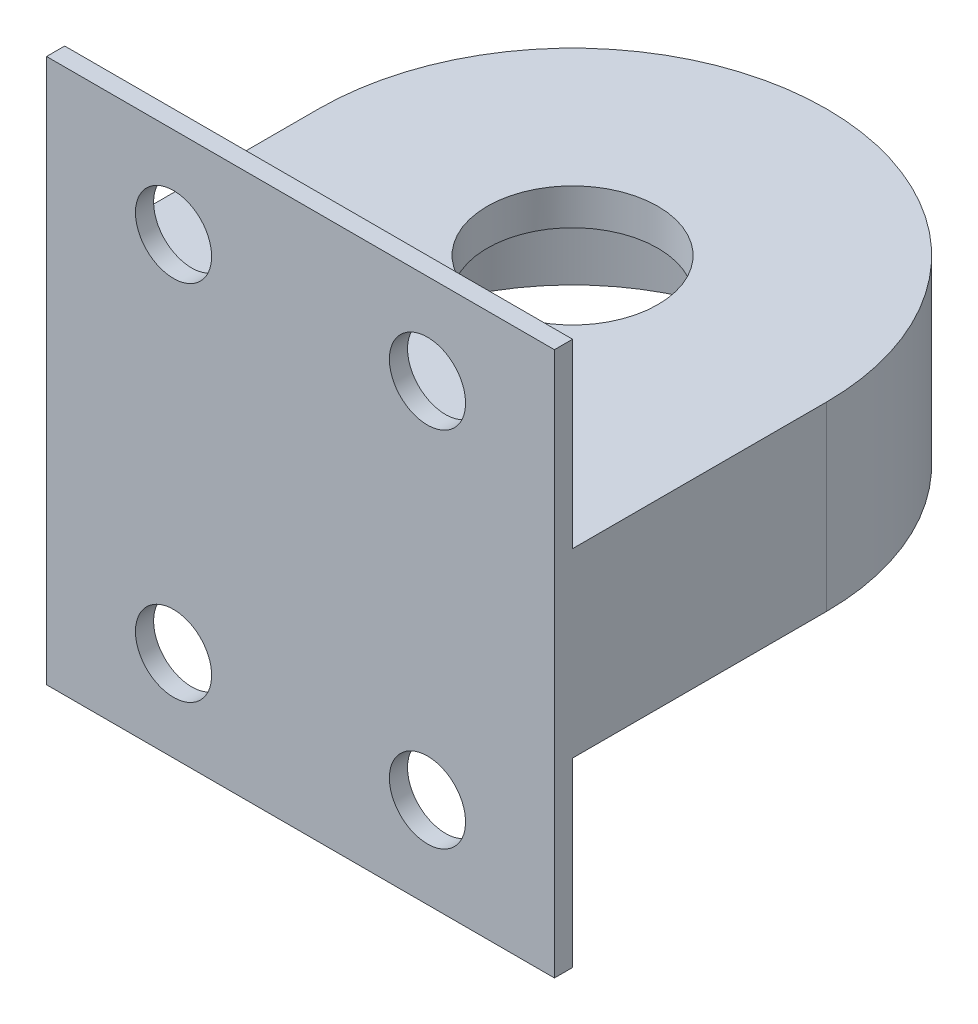
ISO-10303-21;
HEADER;
FILE_DESCRIPTION(('STEP AP214'),'2;1');
FILE_NAME('part.step','',(''),(''),'','','');
FILE_SCHEMA(('AUTOMOTIVE_DESIGN { 1 0 10303 214 1 1 1 1 }'));
ENDSEC;
DATA;
#1=APPLICATION_CONTEXT('core data for automotive mechanical design processes');
#2=APPLICATION_PROTOCOL_DEFINITION('international standard','automotive_design',2000,#1);
#3=PRODUCT_CONTEXT('',#1,'mechanical');
#4=PRODUCT('Part','Part','',(#3));
#5=PRODUCT_RELATED_PRODUCT_CATEGORY('part','',(#4));
#6=PRODUCT_DEFINITION_FORMATION('','',#4);
#7=PRODUCT_DEFINITION_CONTEXT('part definition',#1,'design');
#8=PRODUCT_DEFINITION('design','',#6,#7);
#9=PRODUCT_DEFINITION_SHAPE('','',#8);
#10=(LENGTH_UNIT() NAMED_UNIT(*) SI_UNIT(.MILLI.,.METRE.));
#11=(NAMED_UNIT(*) PLANE_ANGLE_UNIT() SI_UNIT($,.RADIAN.));
#12=(NAMED_UNIT(*) SI_UNIT($,.STERADIAN.) SOLID_ANGLE_UNIT());
#13=UNCERTAINTY_MEASURE_WITH_UNIT(LENGTH_MEASURE(1.E-05),#10,'distance_accuracy_value','');
#14=(GEOMETRIC_REPRESENTATION_CONTEXT(3) GLOBAL_UNCERTAINTY_ASSIGNED_CONTEXT((#13)) GLOBAL_UNIT_ASSIGNED_CONTEXT((#10,
#11,#12)) REPRESENTATION_CONTEXT('',''));
#15=CARTESIAN_POINT('',(0.,0.,0.));
#16=DIRECTION('',(0.,0.,1.));
#17=DIRECTION('',(1.,0.,0.));
#18=AXIS2_PLACEMENT_3D('',#15,#16,#17);
#19=CARTESIAN_POINT('',(-14.,10.,-15.2382418610723));
#20=DIRECTION('',(0.,-1.,0.));
#21=DIRECTION('',(0.,0.,-1.));
#22=AXIS2_PLACEMENT_3D('',#19,#20,#21);
#23=CYLINDRICAL_SURFACE('',#22,4.7);
#24=CARTESIAN_POINT('',(-14.,10.,-15.2382418610723));
#25=DIRECTION('',(0.,1.,0.));
#26=DIRECTION('',(0.,0.,1.));
#27=AXIS2_PLACEMENT_3D('',#24,#25,#26);
#28=CIRCLE('',#27,4.7);
#29=CARTESIAN_POINT('',(-14.,10.,-10.5382418610723));
#30=VERTEX_POINT('',#29);
#31=EDGE_CURVE('E168',#30,#30,#28,.T.);
#32=ORIENTED_EDGE('',*,*,#31,.T.);
#33=EDGE_LOOP('',(#32));
#34=FACE_BOUND('',#33,.T.);
#35=CARTESIAN_POINT('',(-14.,8.,-15.2382418610723));
#36=DIRECTION('',(0.,-1.,0.));
#37=DIRECTION('',(0.,0.,-1.));
#38=AXIS2_PLACEMENT_3D('',#35,#36,#37);
#39=CIRCLE('',#38,4.7);
#40=CARTESIAN_POINT('',(-14.,8.,-19.9382418610723));
#41=VERTEX_POINT('',#40);
#42=EDGE_CURVE('E280',#41,#41,#39,.F.);
#43=ORIENTED_EDGE('',*,*,#42,.F.);
#44=EDGE_LOOP('',(#43));
#45=FACE_BOUND('',#44,.T.);
#46=ADVANCED_FACE('F47',(#34,#45),#23,.F.);
#47=CARTESIAN_POINT('',(0.,10.,0.));
#48=DIRECTION('',(1.,0.,0.));
#49=DIRECTION('',(0.,0.,-1.));
#50=AXIS2_PLACEMENT_3D('',#47,#48,#49);
#51=PLANE('',#50);
#52=DIRECTION('',(0.,0.,1.));
#53=VECTOR('',#52,1.);
#54=CARTESIAN_POINT('',(0.,0.,0.));
#55=LINE('',#54,#53);
#56=CARTESIAN_POINT('',(0.,0.,-15.2382418610723));
#57=VERTEX_POINT('',#56);
#58=CARTESIAN_POINT('',(0.,0.,-1.23824186107226));
#59=VERTEX_POINT('',#58);
#60=EDGE_CURVE('E89',#57,#59,#55,.T.);
#61=ORIENTED_EDGE('',*,*,#60,.F.);
#62=DIRECTION('',(0.,-1.,0.));
#63=VECTOR('',#62,1.);
#64=CARTESIAN_POINT('',(0.,10.,-15.2382418610723));
#65=LINE('',#64,#63);
#66=CARTESIAN_POINT('',(0.,10.,-15.2382418610723));
#67=VERTEX_POINT('',#66);
#68=EDGE_CURVE('E11',#67,#57,#65,.T.);
#69=ORIENTED_EDGE('',*,*,#68,.F.);
#70=DIRECTION('',(0.,0.,1.));
#71=VECTOR('',#70,1.);
#72=CARTESIAN_POINT('',(0.,10.,0.));
#73=LINE('',#72,#71);
#74=CARTESIAN_POINT('',(0.,10.,-1.23824186107226));
#75=VERTEX_POINT('',#74);
#76=EDGE_CURVE('E65',#67,#75,#73,.T.);
#77=ORIENTED_EDGE('',*,*,#76,.T.);
#78=DIRECTION('',(0.,1.,0.));
#79=VECTOR('',#78,1.);
#80=CARTESIAN_POINT('',(0.,20.,-1.23824186107226));
#81=LINE('',#80,#79);
#82=CARTESIAN_POINT('',(0.,20.,-1.23824186107226));
#83=VERTEX_POINT('',#82);
#84=EDGE_CURVE('E202',#75,#83,#81,.T.);
#85=ORIENTED_EDGE('',*,*,#84,.T.);
#86=DIRECTION('',(0.,0.,-1.));
#87=VECTOR('',#86,1.);
#88=CARTESIAN_POINT('',(0.,20.,-0.238241861072258));
#89=LINE('',#88,#87);
#90=CARTESIAN_POINT('',(0.,20.,-0.238241861072258));
#91=VERTEX_POINT('',#90);
#92=EDGE_CURVE('E151',#91,#83,#89,.T.);
#93=ORIENTED_EDGE('',*,*,#92,.F.);
#94=DIRECTION('',(0.,1.,0.));
#95=VECTOR('',#94,1.);
#96=CARTESIAN_POINT('',(0.,20.,-0.238241861072258));
#97=LINE('',#96,#95);
#98=CARTESIAN_POINT('',(0.,-10.,-0.238241861072258));
#99=VERTEX_POINT('',#98);
#100=EDGE_CURVE('E129',#99,#91,#97,.T.);
#101=ORIENTED_EDGE('',*,*,#100,.F.);
#102=DIRECTION('',(0.,0.,-1.));
#103=VECTOR('',#102,1.);
#104=CARTESIAN_POINT('',(0.,-10.,-0.238241861072258));
#105=LINE('',#104,#103);
#106=CARTESIAN_POINT('',(0.,-10.,-1.23824186107226));
#107=VERTEX_POINT('',#106);
#108=EDGE_CURVE('E125',#99,#107,#105,.T.);
#109=ORIENTED_EDGE('',*,*,#108,.T.);
#110=EDGE_CURVE('E203',#107,#59,#81,.T.);
#111=ORIENTED_EDGE('',*,*,#110,.T.);
#112=EDGE_LOOP('',(#61,#69,#77,#85,#93,#101,#109,#111));
#113=FACE_BOUND('',#112,.T.);
#114=ADVANCED_FACE('F49',(#113),#51,.T.);
#115=CARTESIAN_POINT('',(-14.,10.,-15.2382418610723));
#116=DIRECTION('',(0.,-1.,0.));
#117=DIRECTION('',(0.,0.,-1.));
#118=AXIS2_PLACEMENT_3D('',#115,#116,#117);
#119=CYLINDRICAL_SURFACE('',#118,14.);
#120=CARTESIAN_POINT('',(-14.,0.,-15.2382418610723));
#121=DIRECTION('',(0.,1.,0.));
#122=DIRECTION('',(0.,0.,1.));
#123=AXIS2_PLACEMENT_3D('',#120,#121,#122);
#124=CIRCLE('',#123,14.);
#125=CARTESIAN_POINT('',(-28.,0.,-15.2382418610723));
#126=VERTEX_POINT('',#125);
#127=EDGE_CURVE('E149',#57,#126,#124,.T.);
#128=ORIENTED_EDGE('',*,*,#127,.T.);
#129=DIRECTION('',(0.,-1.,0.));
#130=VECTOR('',#129,1.);
#131=CARTESIAN_POINT('',(-28.,10.,-15.2382418610723));
#132=LINE('',#131,#130);
#133=CARTESIAN_POINT('',(-28.,10.,-15.2382418610723));
#134=VERTEX_POINT('',#133);
#135=EDGE_CURVE('E57',#134,#126,#132,.T.);
#136=ORIENTED_EDGE('',*,*,#135,.F.);
#137=CARTESIAN_POINT('',(-14.,10.,-15.2382418610723));
#138=DIRECTION('',(0.,1.,0.));
#139=DIRECTION('',(0.,0.,1.));
#140=AXIS2_PLACEMENT_3D('',#137,#138,#139);
#141=CIRCLE('',#140,14.);
#142=EDGE_CURVE('E157',#67,#134,#141,.T.);
#143=ORIENTED_EDGE('',*,*,#142,.F.);
#144=ORIENTED_EDGE('',*,*,#68,.T.);
#145=EDGE_LOOP('',(#128,#136,#143,#144));
#146=FACE_BOUND('',#145,.T.);
#147=ADVANCED_FACE('F223',(#146),#119,.T.);
#148=CARTESIAN_POINT('',(-28.,10.,0.));
#149=DIRECTION('',(1.,0.,0.));
#150=DIRECTION('',(0.,0.,-1.));
#151=AXIS2_PLACEMENT_3D('',#148,#149,#150);
#152=PLANE('',#151);
#153=DIRECTION('',(0.,0.,1.));
#154=VECTOR('',#153,1.);
#155=CARTESIAN_POINT('',(-28.,0.,0.));
#156=LINE('',#155,#154);
#157=CARTESIAN_POINT('',(-28.,0.,-1.23824186107226));
#158=VERTEX_POINT('',#157);
#159=EDGE_CURVE('E83',#126,#158,#156,.T.);
#160=ORIENTED_EDGE('',*,*,#159,.T.);
#161=DIRECTION('',(0.,-1.,0.));
#162=VECTOR('',#161,1.);
#163=CARTESIAN_POINT('',(-28.,20.,-1.23824186107226));
#164=LINE('',#163,#162);
#165=CARTESIAN_POINT('',(-28.,-10.,-1.23824186107226));
#166=VERTEX_POINT('',#165);
#167=EDGE_CURVE('E143',#158,#166,#164,.T.);
#168=ORIENTED_EDGE('',*,*,#167,.T.);
#169=DIRECTION('',(0.,0.,-1.));
#170=VECTOR('',#169,1.);
#171=CARTESIAN_POINT('',(-28.,-10.,-0.238241861072258));
#172=LINE('',#171,#170);
#173=CARTESIAN_POINT('',(-28.,-10.,-0.238241861072258));
#174=VERTEX_POINT('',#173);
#175=EDGE_CURVE('E123',#174,#166,#172,.T.);
#176=ORIENTED_EDGE('',*,*,#175,.F.);
#177=DIRECTION('',(0.,-1.,0.));
#178=VECTOR('',#177,1.);
#179=CARTESIAN_POINT('',(-28.,20.,-0.238241861072258));
#180=LINE('',#179,#178);
#181=CARTESIAN_POINT('',(-28.,20.,-0.238241861072258));
#182=VERTEX_POINT('',#181);
#183=EDGE_CURVE('E130',#182,#174,#180,.T.);
#184=ORIENTED_EDGE('',*,*,#183,.F.);
#185=DIRECTION('',(0.,0.,-1.));
#186=VECTOR('',#185,1.);
#187=CARTESIAN_POINT('',(-28.,20.,-0.238241861072258));
#188=LINE('',#187,#186);
#189=CARTESIAN_POINT('',(-28.,20.,-1.23824186107226));
#190=VERTEX_POINT('',#189);
#191=EDGE_CURVE('E208',#182,#190,#188,.T.);
#192=ORIENTED_EDGE('',*,*,#191,.T.);
#193=CARTESIAN_POINT('',(-28.,10.,-1.23824186107226));
#194=VERTEX_POINT('',#193);
#195=EDGE_CURVE('E189',#190,#194,#164,.T.);
#196=ORIENTED_EDGE('',*,*,#195,.T.);
#197=DIRECTION('',(0.,0.,1.));
#198=VECTOR('',#197,1.);
#199=CARTESIAN_POINT('',(-28.,10.,0.));
#200=LINE('',#199,#198);
#201=EDGE_CURVE('E161',#134,#194,#200,.T.);
#202=ORIENTED_EDGE('',*,*,#201,.F.);
#203=ORIENTED_EDGE('',*,*,#135,.T.);
#204=EDGE_LOOP('',(#160,#168,#176,#184,#192,#196,#202,#203));
#205=FACE_BOUND('',#204,.T.);
#206=ADVANCED_FACE('F141',(#205),#152,.F.);
#207=CARTESIAN_POINT('',(0.,10.,0.));
#208=DIRECTION('',(0.,1.,0.));
#209=DIRECTION('',(0.,0.,1.));
#210=AXIS2_PLACEMENT_3D('',#207,#208,#209);
#211=PLANE('',#210);
#212=ORIENTED_EDGE('',*,*,#76,.F.);
#213=ORIENTED_EDGE('',*,*,#142,.T.);
#214=ORIENTED_EDGE('',*,*,#201,.T.);
#215=DIRECTION('',(-1.,0.,0.));
#216=VECTOR('',#215,1.);
#217=CARTESIAN_POINT('',(0.,10.,-1.23824186107226));
#218=LINE('',#217,#216);
#219=EDGE_CURVE('E164',#75,#194,#218,.T.);
#220=ORIENTED_EDGE('',*,*,#219,.F.);
#221=EDGE_LOOP('',(#212,#213,#214,#220));
#222=FACE_BOUND('',#221,.T.);
#223=ORIENTED_EDGE('',*,*,#31,.F.);
#224=EDGE_LOOP('',(#223));
#225=FACE_BOUND('',#224,.T.);
#226=ADVANCED_FACE('F221',(#222,#225),#211,.T.);
#227=CARTESIAN_POINT('',(0.,0.,0.));
#228=DIRECTION('',(0.,1.,0.));
#229=DIRECTION('',(0.,0.,1.));
#230=AXIS2_PLACEMENT_3D('',#227,#228,#229);
#231=PLANE('',#230);
#232=CARTESIAN_POINT('',(-14.,0.,-15.2382418610723));
#233=DIRECTION('',(0.,-1.,0.));
#234=DIRECTION('',(0.,0.,-1.));
#235=AXIS2_PLACEMENT_3D('',#232,#233,#234);
#236=CIRCLE('',#235,12.15);
#237=CARTESIAN_POINT('',(-14.,0.,-27.3882418610723));
#238=VERTEX_POINT('',#237);
#239=EDGE_CURVE('E292',#238,#238,#236,.T.);
#240=ORIENTED_EDGE('',*,*,#239,.F.);
#241=EDGE_LOOP('',(#240));
#242=FACE_BOUND('',#241,.T.);
#243=ORIENTED_EDGE('',*,*,#60,.T.);
#244=DIRECTION('',(-1.,0.,0.));
#245=VECTOR('',#244,1.);
#246=CARTESIAN_POINT('',(0.,0.,-1.23824186107226));
#247=LINE('',#246,#245);
#248=EDGE_CURVE('E158',#59,#158,#247,.T.);
#249=ORIENTED_EDGE('',*,*,#248,.T.);
#250=ORIENTED_EDGE('',*,*,#159,.F.);
#251=ORIENTED_EDGE('',*,*,#127,.F.);
#252=EDGE_LOOP('',(#243,#249,#250,#251));
#253=FACE_BOUND('',#252,.T.);
#254=ADVANCED_FACE('F182',(#242,#253),#231,.F.);
#255=CARTESIAN_POINT('',(0.,0.,-1.23824186107226));
#256=DIRECTION('',(0.,0.,1.));
#257=DIRECTION('',(1.,0.,0.));
#258=AXIS2_PLACEMENT_3D('',#255,#256,#257);
#259=PLANE('',#258);
#260=CARTESIAN_POINT('',(-7.,15.,-1.23824186107226));
#261=DIRECTION('',(0.,0.,-1.));
#262=DIRECTION('',(-1.,0.,0.));
#263=AXIS2_PLACEMENT_3D('',#260,#261,#262);
#264=CIRCLE('',#263,2.09999999999999);
#265=CARTESIAN_POINT('',(-9.09999999999998,15.,-1.23824186107226));
#266=VERTEX_POINT('',#265);
#267=EDGE_CURVE('E285',#266,#266,#264,.T.);
#268=ORIENTED_EDGE('',*,*,#267,.F.);
#269=EDGE_LOOP('',(#268));
#270=FACE_BOUND('',#269,.T.);
#271=CARTESIAN_POINT('',(-21.,15.,-1.23824186107226));
#272=DIRECTION('',(0.,0.,-1.));
#273=DIRECTION('',(-1.,0.,0.));
#274=AXIS2_PLACEMENT_3D('',#271,#272,#273);
#275=CIRCLE('',#274,2.09999999999999);
#276=CARTESIAN_POINT('',(-23.1,15.,-1.23824186107226));
#277=VERTEX_POINT('',#276);
#278=EDGE_CURVE('E301',#277,#277,#275,.T.);
#279=ORIENTED_EDGE('',*,*,#278,.F.);
#280=EDGE_LOOP('',(#279));
#281=FACE_BOUND('',#280,.T.);
#282=ORIENTED_EDGE('',*,*,#84,.F.);
#283=ORIENTED_EDGE('',*,*,#219,.T.);
#284=ORIENTED_EDGE('',*,*,#195,.F.);
#285=DIRECTION('',(-1.,0.,0.));
#286=VECTOR('',#285,1.);
#287=CARTESIAN_POINT('',(-28.,20.,-1.23824186107226));
#288=LINE('',#287,#286);
#289=EDGE_CURVE('E139',#83,#190,#288,.T.);
#290=ORIENTED_EDGE('',*,*,#289,.F.);
#291=EDGE_LOOP('',(#282,#283,#284,#290));
#292=FACE_BOUND('',#291,.T.);
#293=ADVANCED_FACE('F219',(#270,#281,#292),#259,.F.);
#294=CARTESIAN_POINT('',(-28.,-10.,-0.238241861072258));
#295=DIRECTION('',(0.,1.,0.));
#296=DIRECTION('',(0.,0.,1.));
#297=AXIS2_PLACEMENT_3D('',#294,#295,#296);
#298=PLANE('',#297);
#299=DIRECTION('',(1.,0.,0.));
#300=VECTOR('',#299,1.);
#301=CARTESIAN_POINT('',(-28.,-10.,-1.23824186107226));
#302=LINE('',#301,#300);
#303=EDGE_CURVE('E187',#166,#107,#302,.T.);
#304=ORIENTED_EDGE('',*,*,#303,.T.);
#305=ORIENTED_EDGE('',*,*,#108,.F.);
#306=DIRECTION('',(1.,0.,0.));
#307=VECTOR('',#306,1.);
#308=CARTESIAN_POINT('',(-28.,-10.,-0.238241861072258));
#309=LINE('',#308,#307);
#310=EDGE_CURVE('E119',#174,#99,#309,.T.);
#311=ORIENTED_EDGE('',*,*,#310,.F.);
#312=ORIENTED_EDGE('',*,*,#175,.T.);
#313=EDGE_LOOP('',(#304,#305,#311,#312));
#314=FACE_BOUND('',#313,.T.);
#315=ADVANCED_FACE('F121',(#314),#298,.F.);
#316=CARTESIAN_POINT('',(-28.,20.,-0.238241861072258));
#317=DIRECTION('',(0.,-1.,0.));
#318=DIRECTION('',(0.,0.,-1.));
#319=AXIS2_PLACEMENT_3D('',#316,#317,#318);
#320=PLANE('',#319);
#321=ORIENTED_EDGE('',*,*,#289,.T.);
#322=ORIENTED_EDGE('',*,*,#191,.F.);
#323=DIRECTION('',(-1.,0.,0.));
#324=VECTOR('',#323,1.);
#325=CARTESIAN_POINT('',(-28.,20.,-0.238241861072258));
#326=LINE('',#325,#324);
#327=EDGE_CURVE('E135',#91,#182,#326,.T.);
#328=ORIENTED_EDGE('',*,*,#327,.F.);
#329=ORIENTED_EDGE('',*,*,#92,.T.);
#330=EDGE_LOOP('',(#321,#322,#328,#329));
#331=FACE_BOUND('',#330,.T.);
#332=ADVANCED_FACE('F215',(#331),#320,.F.);
#333=CARTESIAN_POINT('',(0.,0.,-0.238241861072258));
#334=DIRECTION('',(0.,0.,1.));
#335=DIRECTION('',(1.,0.,0.));
#336=AXIS2_PLACEMENT_3D('',#333,#334,#335);
#337=PLANE('',#336);
#338=CARTESIAN_POINT('',(-7.,15.,-0.238241861072258));
#339=DIRECTION('',(0.,0.,-1.));
#340=DIRECTION('',(-1.,0.,0.));
#341=AXIS2_PLACEMENT_3D('',#338,#339,#340);
#342=CIRCLE('',#341,2.1);
#343=CARTESIAN_POINT('',(-9.1,15.,-0.238241861072258));
#344=VERTEX_POINT('',#343);
#345=EDGE_CURVE('E290',#344,#344,#342,.T.);
#346=ORIENTED_EDGE('',*,*,#345,.T.);
#347=EDGE_LOOP('',(#346));
#348=FACE_BOUND('',#347,.T.);
#349=CARTESIAN_POINT('',(-21.,15.,-0.238241861072258));
#350=DIRECTION('',(0.,0.,-1.));
#351=DIRECTION('',(-1.,0.,0.));
#352=AXIS2_PLACEMENT_3D('',#349,#350,#351);
#353=CIRCLE('',#352,2.1);
#354=CARTESIAN_POINT('',(-23.1,15.,-0.238241861072258));
#355=VERTEX_POINT('',#354);
#356=EDGE_CURVE('E305',#355,#355,#353,.T.);
#357=ORIENTED_EDGE('',*,*,#356,.T.);
#358=EDGE_LOOP('',(#357));
#359=FACE_BOUND('',#358,.T.);
#360=CARTESIAN_POINT('',(-7.,-5.,-0.238241861072258));
#361=DIRECTION('',(0.,0.,-1.));
#362=DIRECTION('',(-1.,0.,0.));
#363=AXIS2_PLACEMENT_3D('',#360,#361,#362);
#364=CIRCLE('',#363,2.1);
#365=CARTESIAN_POINT('',(-9.1,-5.,-0.238241861072258));
#366=VERTEX_POINT('',#365);
#367=EDGE_CURVE('E313',#366,#366,#364,.T.);
#368=ORIENTED_EDGE('',*,*,#367,.T.);
#369=EDGE_LOOP('',(#368));
#370=FACE_BOUND('',#369,.T.);
#371=CARTESIAN_POINT('',(-21.,-5.,-0.238241861072258));
#372=DIRECTION('',(0.,0.,-1.));
#373=DIRECTION('',(-1.,0.,0.));
#374=AXIS2_PLACEMENT_3D('',#371,#372,#373);
#375=CIRCLE('',#374,2.1);
#376=CARTESIAN_POINT('',(-23.1,-5.,-0.238241861072258));
#377=VERTEX_POINT('',#376);
#378=EDGE_CURVE('E190',#377,#377,#375,.T.);
#379=ORIENTED_EDGE('',*,*,#378,.T.);
#380=EDGE_LOOP('',(#379));
#381=FACE_BOUND('',#380,.T.);
#382=ORIENTED_EDGE('',*,*,#183,.T.);
#383=ORIENTED_EDGE('',*,*,#310,.T.);
#384=ORIENTED_EDGE('',*,*,#100,.T.);
#385=ORIENTED_EDGE('',*,*,#327,.T.);
#386=EDGE_LOOP('',(#382,#383,#384,#385));
#387=FACE_BOUND('',#386,.T.);
#388=ADVANCED_FACE('F133',(#348,#359,#370,#381,#387),#337,.T.);
#389=CARTESIAN_POINT('',(-7.,-5.,-1.23824186107226));
#390=DIRECTION('',(0.,0.,-1.));
#391=DIRECTION('',(-1.,0.,0.));
#392=AXIS2_PLACEMENT_3D('',#389,#390,#391);
#393=CIRCLE('',#392,2.09999999999999);
#394=CARTESIAN_POINT('',(-9.09999999999998,-5.,-1.23824186107226));
#395=VERTEX_POINT('',#394);
#396=EDGE_CURVE('E309',#395,#395,#393,.T.);
#397=ORIENTED_EDGE('',*,*,#396,.F.);
#398=EDGE_LOOP('',(#397));
#399=FACE_BOUND('',#398,.T.);
#400=CARTESIAN_POINT('',(-21.,-5.,-1.23824186107226));
#401=DIRECTION('',(0.,0.,-1.));
#402=DIRECTION('',(-1.,0.,0.));
#403=AXIS2_PLACEMENT_3D('',#400,#401,#402);
#404=CIRCLE('',#403,2.09999999999999);
#405=CARTESIAN_POINT('',(-23.1,-5.,-1.23824186107226));
#406=VERTEX_POINT('',#405);
#407=EDGE_CURVE('E195',#406,#406,#404,.T.);
#408=ORIENTED_EDGE('',*,*,#407,.F.);
#409=EDGE_LOOP('',(#408));
#410=FACE_BOUND('',#409,.T.);
#411=ORIENTED_EDGE('',*,*,#248,.F.);
#412=ORIENTED_EDGE('',*,*,#110,.F.);
#413=ORIENTED_EDGE('',*,*,#303,.F.);
#414=ORIENTED_EDGE('',*,*,#167,.F.);
#415=EDGE_LOOP('',(#411,#412,#413,#414));
#416=FACE_BOUND('',#415,.T.);
#417=ADVANCED_FACE('F186',(#399,#410,#416),#259,.F.);
#418=CARTESIAN_POINT('',(-21.,-5.,-1.23824186107226));
#419=DIRECTION('',(0.,0.,-1.));
#420=DIRECTION('',(-1.,0.,0.));
#421=AXIS2_PLACEMENT_3D('',#418,#419,#420);
#422=CYLINDRICAL_SURFACE('',#421,2.09999999999999);
#423=ORIENTED_EDGE('',*,*,#378,.F.);
#424=EDGE_LOOP('',(#423));
#425=FACE_BOUND('',#424,.T.);
#426=ORIENTED_EDGE('',*,*,#407,.T.);
#427=EDGE_LOOP('',(#426));
#428=FACE_BOUND('',#427,.T.);
#429=ADVANCED_FACE('F249',(#425,#428),#422,.F.);
#430=CARTESIAN_POINT('',(-7.,-5.,-1.23824186107226));
#431=DIRECTION('',(0.,0.,-1.));
#432=DIRECTION('',(-1.,0.,0.));
#433=AXIS2_PLACEMENT_3D('',#430,#431,#432);
#434=CYLINDRICAL_SURFACE('',#433,2.09999999999999);
#435=ORIENTED_EDGE('',*,*,#367,.F.);
#436=EDGE_LOOP('',(#435));
#437=FACE_BOUND('',#436,.T.);
#438=ORIENTED_EDGE('',*,*,#396,.T.);
#439=EDGE_LOOP('',(#438));
#440=FACE_BOUND('',#439,.T.);
#441=ADVANCED_FACE('F256',(#437,#440),#434,.F.);
#442=CARTESIAN_POINT('',(-21.,15.,-1.23824186107226));
#443=DIRECTION('',(0.,0.,-1.));
#444=DIRECTION('',(-1.,0.,0.));
#445=AXIS2_PLACEMENT_3D('',#442,#443,#444);
#446=CYLINDRICAL_SURFACE('',#445,2.09999999999999);
#447=ORIENTED_EDGE('',*,*,#356,.F.);
#448=EDGE_LOOP('',(#447));
#449=FACE_BOUND('',#448,.T.);
#450=ORIENTED_EDGE('',*,*,#278,.T.);
#451=EDGE_LOOP('',(#450));
#452=FACE_BOUND('',#451,.T.);
#453=ADVANCED_FACE('F260',(#449,#452),#446,.F.);
#454=CARTESIAN_POINT('',(-7.,15.,-1.23824186107226));
#455=DIRECTION('',(0.,0.,-1.));
#456=DIRECTION('',(-1.,0.,0.));
#457=AXIS2_PLACEMENT_3D('',#454,#455,#456);
#458=CYLINDRICAL_SURFACE('',#457,2.09999999999999);
#459=ORIENTED_EDGE('',*,*,#345,.F.);
#460=EDGE_LOOP('',(#459));
#461=FACE_BOUND('',#460,.T.);
#462=ORIENTED_EDGE('',*,*,#267,.T.);
#463=EDGE_LOOP('',(#462));
#464=FACE_BOUND('',#463,.T.);
#465=ADVANCED_FACE('F264',(#461,#464),#458,.F.);
#466=CARTESIAN_POINT('',(-14.,8.,-15.2382418610723));
#467=DIRECTION('',(0.,-1.,0.));
#468=DIRECTION('',(0.,0.,-1.));
#469=AXIS2_PLACEMENT_3D('',#466,#467,#468);
#470=CYLINDRICAL_SURFACE('',#469,12.15);
#471=CARTESIAN_POINT('',(-14.,8.,-15.2382418610723));
#472=DIRECTION('',(0.,-1.,0.));
#473=DIRECTION('',(0.,0.,-1.));
#474=AXIS2_PLACEMENT_3D('',#471,#472,#473);
#475=CIRCLE('',#474,12.15);
#476=CARTESIAN_POINT('',(-14.,8.,-27.3882418610723));
#477=VERTEX_POINT('',#476);
#478=EDGE_CURVE('E283',#477,#477,#475,.T.);
#479=ORIENTED_EDGE('',*,*,#478,.F.);
#480=EDGE_LOOP('',(#479));
#481=FACE_BOUND('',#480,.T.);
#482=ORIENTED_EDGE('',*,*,#239,.T.);
#483=EDGE_LOOP('',(#482));
#484=FACE_BOUND('',#483,.T.);
#485=ADVANCED_FACE('F267',(#481,#484),#470,.F.);
#486=CARTESIAN_POINT('',(0.,8.,0.));
#487=DIRECTION('',(0.,-1.,0.));
#488=DIRECTION('',(0.,0.,-1.));
#489=AXIS2_PLACEMENT_3D('',#486,#487,#488);
#490=PLANE('',#489);
#491=ORIENTED_EDGE('',*,*,#42,.T.);
#492=EDGE_LOOP('',(#491));
#493=FACE_BOUND('',#492,.T.);
#494=ORIENTED_EDGE('',*,*,#478,.T.);
#495=EDGE_LOOP('',(#494));
#496=FACE_BOUND('',#495,.T.);
#497=ADVANCED_FACE('F271',(#493,#496),#490,.T.);
#498=CLOSED_SHELL('',(#46,#114,#147,#206,#226,#254,#293,#315,#332,#388,#417,#429,#441,#453,#465,
#485,#497));
#499=MANIFOLD_SOLID_BREP('B2',#498);
#500=ADVANCED_BREP_SHAPE_REPRESENTATION('',(#18,#499),#14);
#501=SHAPE_DEFINITION_REPRESENTATION(#9,#500);
ENDSEC;
END-ISO-10303-21;
